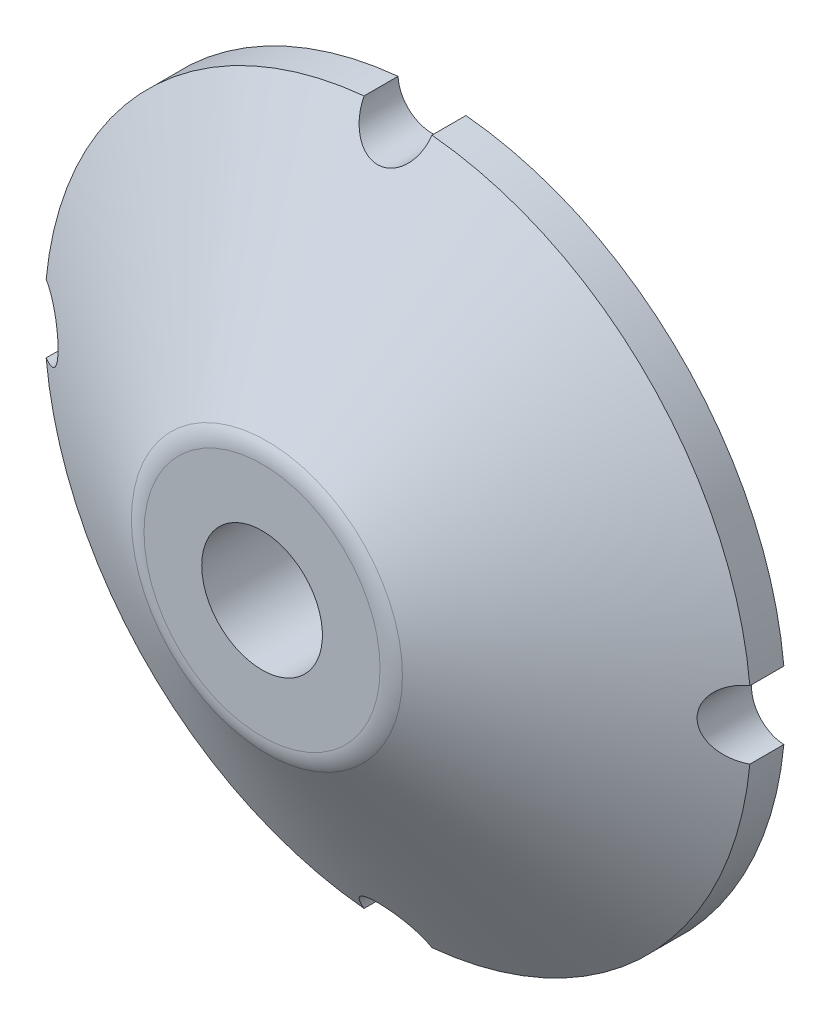
ISO-10303-21;
HEADER;
FILE_DESCRIPTION(('STEP AP214'),'2;1');
FILE_NAME('part.step','',(''),(''),'','','');
FILE_SCHEMA(('AUTOMOTIVE_DESIGN { 1 0 10303 214 1 1 1 1 }'));
ENDSEC;
DATA;
#1=APPLICATION_CONTEXT('core data for automotive mechanical design processes');
#2=APPLICATION_PROTOCOL_DEFINITION('international standard','automotive_design',2000,#1);
#3=PRODUCT_CONTEXT('',#1,'mechanical');
#4=PRODUCT('Part','Part','',(#3));
#5=PRODUCT_RELATED_PRODUCT_CATEGORY('part','',(#4));
#6=PRODUCT_DEFINITION_FORMATION('','',#4);
#7=PRODUCT_DEFINITION_CONTEXT('part definition',#1,'design');
#8=PRODUCT_DEFINITION('design','',#6,#7);
#9=PRODUCT_DEFINITION_SHAPE('','',#8);
#10=(LENGTH_UNIT() NAMED_UNIT(*) SI_UNIT(.MILLI.,.METRE.));
#11=(NAMED_UNIT(*) PLANE_ANGLE_UNIT() SI_UNIT($,.RADIAN.));
#12=(NAMED_UNIT(*) SI_UNIT($,.STERADIAN.) SOLID_ANGLE_UNIT());
#13=UNCERTAINTY_MEASURE_WITH_UNIT(LENGTH_MEASURE(1.E-05),#10,'distance_accuracy_value','');
#14=(GEOMETRIC_REPRESENTATION_CONTEXT(3) GLOBAL_UNCERTAINTY_ASSIGNED_CONTEXT((#13)) GLOBAL_UNIT_ASSIGNED_CONTEXT((#10,
#11,#12)) REPRESENTATION_CONTEXT('',''));
#15=CARTESIAN_POINT('',(0.,0.,0.));
#16=DIRECTION('',(0.,0.,1.));
#17=DIRECTION('',(1.,0.,0.));
#18=AXIS2_PLACEMENT_3D('',#15,#16,#17);
#19=CARTESIAN_POINT('',(0.,17.,0.));
#20=DIRECTION('',(0.,0.,-1.));
#21=DIRECTION('',(-1.,0.,0.));
#22=AXIS2_PLACEMENT_3D('',#19,#20,#21);
#23=PLANE('',#22);
#24=CARTESIAN_POINT('',(0.,0.,0.));
#25=DIRECTION('',(0.,0.,-1.));
#26=DIRECTION('',(-1.,0.,0.));
#27=AXIS2_PLACEMENT_3D('',#24,#25,#26);
#28=CIRCLE('',#27,17.);
#29=CARTESIAN_POINT('',(-17.,0.,0.));
#30=VERTEX_POINT('',#29);
#31=EDGE_CURVE('E127',#30,#30,#28,.T.);
#32=ORIENTED_EDGE('',*,*,#31,.F.);
#33=EDGE_LOOP('',(#32));
#34=FACE_BOUND('',#33,.T.);
#35=CARTESIAN_POINT('',(0.,0.,0.));
#36=DIRECTION('',(0.,0.,-1.));
#37=DIRECTION('',(-1.,0.,0.));
#38=AXIS2_PLACEMENT_3D('',#35,#36,#37);
#39=CIRCLE('',#38,20.8);
#40=CARTESIAN_POINT('',(-1.99768727229009,-20.7038461538462,0.));
#41=VERTEX_POINT('',#40);
#42=CARTESIAN_POINT('',(-20.7038461538462,-1.9976872722901,0.));
#43=VERTEX_POINT('',#42);
#44=EDGE_CURVE('E112',#41,#43,#39,.T.);
#45=ORIENTED_EDGE('',*,*,#44,.T.);
#46=CARTESIAN_POINT('',(-20.8,0.,0.));
#47=DIRECTION('',(0.,0.,1.));
#48=DIRECTION('',(1.,0.,0.));
#49=AXIS2_PLACEMENT_3D('',#46,#47,#48);
#50=CIRCLE('',#49,2.);
#51=CARTESIAN_POINT('',(-20.7038461538462,1.99768727229009,0.));
#52=VERTEX_POINT('',#51);
#53=EDGE_CURVE('E98',#43,#52,#50,.T.);
#54=ORIENTED_EDGE('',*,*,#53,.T.);
#55=CARTESIAN_POINT('',(-1.99768727229009,20.7038461538462,0.));
#56=VERTEX_POINT('',#55);
#57=EDGE_CURVE('E120',#52,#56,#39,.T.);
#58=ORIENTED_EDGE('',*,*,#57,.T.);
#59=CARTESIAN_POINT('',(0.,20.8,0.));
#60=DIRECTION('',(0.,0.,1.));
#61=DIRECTION('',(1.,0.,0.));
#62=AXIS2_PLACEMENT_3D('',#59,#60,#61);
#63=CIRCLE('',#62,2.);
#64=CARTESIAN_POINT('',(1.99768727229009,20.7038461538462,0.));
#65=VERTEX_POINT('',#64);
#66=EDGE_CURVE('E180',#56,#65,#63,.T.);
#67=ORIENTED_EDGE('',*,*,#66,.T.);
#68=CARTESIAN_POINT('',(20.7038461538462,1.99768727229009,0.));
#69=VERTEX_POINT('',#68);
#70=EDGE_CURVE('E122',#65,#69,#39,.T.);
#71=ORIENTED_EDGE('',*,*,#70,.T.);
#72=CARTESIAN_POINT('',(20.8,0.,0.));
#73=DIRECTION('',(0.,0.,1.));
#74=DIRECTION('',(1.,0.,0.));
#75=AXIS2_PLACEMENT_3D('',#72,#73,#74);
#76=CIRCLE('',#75,2.);
#77=CARTESIAN_POINT('',(20.7038461538462,-1.99768727229009,0.));
#78=VERTEX_POINT('',#77);
#79=EDGE_CURVE('E264',#69,#78,#76,.T.);
#80=ORIENTED_EDGE('',*,*,#79,.T.);
#81=CARTESIAN_POINT('',(1.99768727229009,-20.7038461538462,0.));
#82=VERTEX_POINT('',#81);
#83=EDGE_CURVE('E119',#78,#82,#39,.T.);
#84=ORIENTED_EDGE('',*,*,#83,.T.);
#85=CARTESIAN_POINT('',(0.,-20.8,0.));
#86=DIRECTION('',(0.,0.,1.));
#87=DIRECTION('',(1.,0.,0.));
#88=AXIS2_PLACEMENT_3D('',#85,#86,#87);
#89=CIRCLE('',#88,2.);
#90=EDGE_CURVE('E118',#82,#41,#89,.T.);
#91=ORIENTED_EDGE('',*,*,#90,.T.);
#92=EDGE_LOOP('',(#45,#54,#58,#67,#71,#80,#84,#91));
#93=FACE_BOUND('',#92,.T.);
#94=ADVANCED_FACE('F35',(#34,#93),#23,.T.);
#95=CARTESIAN_POINT('',(0.,0.,0.));
#96=DIRECTION('',(0.,0.,-1.));
#97=DIRECTION('',(-1.,0.,0.));
#98=AXIS2_PLACEMENT_3D('',#95,#96,#97);
#99=CYLINDRICAL_SURFACE('',#98,20.8);
#100=ORIENTED_EDGE('',*,*,#57,.F.);
#101=DIRECTION('',(0.,0.,-1.));
#102=VECTOR('',#101,1.);
#103=CARTESIAN_POINT('',(-20.7038461538462,1.99768727229009,1.));
#104=LINE('',#103,#102);
#105=CARTESIAN_POINT('',(-20.7038461538462,1.99768727229009,2.));
#106=VERTEX_POINT('',#105);
#107=EDGE_CURVE('E101',#106,#52,#104,.T.);
#108=ORIENTED_EDGE('',*,*,#107,.F.);
#109=CARTESIAN_POINT('',(0.,0.,2.));
#110=DIRECTION('',(0.,0.,-1.));
#111=DIRECTION('',(-1.,0.,0.));
#112=AXIS2_PLACEMENT_3D('',#109,#110,#111);
#113=CIRCLE('',#112,20.8);
#114=CARTESIAN_POINT('',(-1.99768727229009,20.7038461538462,2.));
#115=VERTEX_POINT('',#114);
#116=EDGE_CURVE('E198',#106,#115,#113,.T.);
#117=ORIENTED_EDGE('',*,*,#116,.T.);
#118=DIRECTION('',(0.,0.,-1.));
#119=VECTOR('',#118,1.);
#120=CARTESIAN_POINT('',(-1.99768727229009,20.7038461538462,1.));
#121=LINE('',#120,#119);
#122=EDGE_CURVE('E266',#56,#115,#121,.F.);
#123=ORIENTED_EDGE('',*,*,#122,.F.);
#124=EDGE_LOOP('',(#100,#108,#117,#123));
#125=FACE_BOUND('',#124,.T.);
#126=ADVANCED_FACE('F145',(#125),#99,.T.);
#127=CARTESIAN_POINT('',(-1.99768727229009,-20.7038461538462,2.));
#128=VERTEX_POINT('',#127);
#129=CARTESIAN_POINT('',(-20.7038461538462,-1.9976872722901,2.));
#130=VERTEX_POINT('',#129);
#131=EDGE_CURVE('E114',#128,#130,#113,.T.);
#132=ORIENTED_EDGE('',*,*,#131,.T.);
#133=DIRECTION('',(0.,0.,-1.));
#134=VECTOR('',#133,1.);
#135=CARTESIAN_POINT('',(-20.7038461538462,-1.9976872722901,1.));
#136=LINE('',#135,#134);
#137=EDGE_CURVE('E50',#43,#130,#136,.F.);
#138=ORIENTED_EDGE('',*,*,#137,.F.);
#139=ORIENTED_EDGE('',*,*,#44,.F.);
#140=DIRECTION('',(0.,0.,-1.));
#141=VECTOR('',#140,1.);
#142=CARTESIAN_POINT('',(-1.99768727229009,-20.7038461538462,1.));
#143=LINE('',#142,#141);
#144=EDGE_CURVE('E240',#128,#41,#143,.T.);
#145=ORIENTED_EDGE('',*,*,#144,.F.);
#146=EDGE_LOOP('',(#132,#138,#139,#145));
#147=FACE_BOUND('',#146,.T.);
#148=ADVANCED_FACE('F110',(#147),#99,.T.);
#149=CARTESIAN_POINT('',(0.,0.,2.));
#150=DIRECTION('',(0.,0.,-1.));
#151=DIRECTION('',(-1.,0.,0.));
#152=AXIS2_PLACEMENT_3D('',#149,#150,#151);
#153=CONICAL_SURFACE('',#152,20.8,1.02927185459833);
#154=CARTESIAN_POINT('',(0.,0.,9.7138477979579));
#155=DIRECTION('',(0.,0.,1.));
#156=DIRECTION('',(1.,0.,0.));
#157=AXIS2_PLACEMENT_3D('',#154,#155,#156);
#158=CIRCLE('',#157,7.97572803589499);
#159=CARTESIAN_POINT('',(7.97572803589499,0.,9.7138477979579));
#160=VERTEX_POINT('',#159);
#161=EDGE_CURVE('E43',#160,#160,#158,.F.);
#162=ORIENTED_EDGE('',*,*,#161,.T.);
#163=EDGE_LOOP('',(#162));
#164=FACE_BOUND('',#163,.T.);
#165=ORIENTED_EDGE('',*,*,#116,.F.);
#166=CARTESIAN_POINT('',(-20.7041786565039,-1.9977032487661,1.99979999999989));
#167=CARTESIAN_POINT('',(-20.5586416011213,-1.99073290417969,2.08728640097025));
#168=CARTESIAN_POINT('',(-20.4139077991781,-1.967831763049,2.1753121498344));
#169=CARTESIAN_POINT('',(-20.1304472498115,-1.89035627195168,2.34949197709587));
#170=CARTESIAN_POINT('',(-19.991773500038,-1.83554641435802,2.4356271432097));
#171=CARTESIAN_POINT('',(-19.7426338778025,-1.70279617114001,2.59195823833128));
#172=CARTESIAN_POINT('',(-19.630765372245,-1.62830710045065,2.66284056761539));
#173=CARTESIAN_POINT('',(-19.4218167294599,-1.45562914499135,2.79631115772232));
#174=CARTESIAN_POINT('',(-19.3246779588634,-1.35753847407497,2.85893216684074));
#175=CARTESIAN_POINT('',(-19.1747955868022,-1.16996285626182,2.9562025446678));
#176=CARTESIAN_POINT('',(-19.1172466085535,-1.08580271656086,2.99376768712256));
#177=CARTESIAN_POINT('',(-19.0146399184898,-0.907232393332686,3.06100772525477));
#178=CARTESIAN_POINT('',(-18.9695791302043,-0.812824742273569,3.09068456414511));
#179=CARTESIAN_POINT('',(-18.8940272649039,-0.615237993411322,3.14057726312456));
#180=CARTESIAN_POINT('',(-18.8636269134673,-0.51200881520496,3.16073419416272));
#181=CARTESIAN_POINT('',(-18.8197623995859,-0.300493961621938,3.18985371484071));
#182=CARTESIAN_POINT('',(-18.8062864090251,-0.192211872582624,3.19882412249932));
#183=CARTESIAN_POINT('',(-18.7976905677202,0.0135014108294007,3.20454439333401));
#184=CARTESIAN_POINT('',(-18.8007275645012,0.110826830551584,3.20252134389357));
#185=CARTESIAN_POINT('',(-18.8207739450462,0.303358831769824,3.18918910211895));
#186=CARTESIAN_POINT('',(-18.8377813842353,0.398565706256424,3.17788120216249));
#187=CARTESIAN_POINT('',(-18.8842180616984,0.581800156899532,3.1470891942953));
#188=CARTESIAN_POINT('',(-18.9133175260579,0.669949237303081,3.12782222291343));
#189=CARTESIAN_POINT('',(-18.9825437043882,0.839804378239371,3.08214875450569));
#190=CARTESIAN_POINT('',(-19.0226732954475,0.921508750574153,3.05574039475538));
#191=CARTESIAN_POINT('',(-19.1163927843596,1.08398347529431,2.99433049018485));
#192=CARTESIAN_POINT('',(-19.1708566849813,1.16403829421563,2.9587770914947));
#193=CARTESIAN_POINT('',(-19.2890830957558,1.31386844915183,2.88201646227923));
#194=CARTESIAN_POINT('',(-19.3528493144695,1.38363966298844,2.84080697722783));
#195=CARTESIAN_POINT('',(-19.4981216932371,1.52205085967941,2.74747712021278));
#196=CARTESIAN_POINT('',(-19.5808524884666,1.5889268067049,2.69464898575496));
#197=CARTESIAN_POINT('',(-19.7539624967148,1.70788026677894,2.5849104449291));
#198=CARTESIAN_POINT('',(-19.8443498430974,1.75994178038517,2.52799570749178));
#199=CARTESIAN_POINT('',(-20.0452277154851,1.85595578155099,2.40245350682534));
#200=CARTESIAN_POINT('',(-20.1566538820859,1.8973739214745,2.33338452426101));
#201=CARTESIAN_POINT('',(-20.3839414847301,1.95978330839613,2.19372951978411));
#202=CARTESIAN_POINT('',(-20.499795232066,1.98080843060422,2.12314621343046));
#203=CARTESIAN_POINT('',(-20.6456736579764,1.99425284234459,2.03502725228237));
#204=CARTESIAN_POINT('',(-20.6749113619588,1.99630017353421,2.01740358888363));
#205=CARTESIAN_POINT('',(-20.7041786565039,1.99770324876609,1.99979999999989));
#206=B_SPLINE_CURVE_WITH_KNOTS('',3,(#166,#167,#168,#169,#170,#171,#172,#173,#174,#175,#176,
#177,#178,#179,#180,#181,#182,#183,#184,#185,#186,#187,#188,#189,#190,#191,#192,#193,#194,#195,
#196,#197,#198,#199,#200,#201,#202,#203,#204,#205),.UNSPECIFIED.,.F.,.F.,(4,2,2,2,2,2,2,2,2,2,2,
2,2,2,2,2,2,2,2,4),(0.,0.509554990811148,1.0229193931966,1.47629511988268,1.92781587676408,
2.25248183821207,2.57706774683279,2.90363735682386,3.22997860625034,3.5206969766378,
3.81137488818691,4.09459767240063,4.37789440241981,4.68613273111527,4.9944942829167,
5.3494512859905,5.70479019666885,6.11559656084411,6.52571935248949,6.6282918216377),.UNSPECIFIED.);
#207=EDGE_CURVE('E105',#130,#106,#206,.T.);
#208=ORIENTED_EDGE('',*,*,#207,.F.);
#209=ORIENTED_EDGE('',*,*,#131,.F.);
#210=CARTESIAN_POINT('',(1.9977032487661,-20.7041786565039,1.99979999999989));
#211=CARTESIAN_POINT('',(1.99073290417969,-20.5586416011213,2.08728640097025));
#212=CARTESIAN_POINT('',(1.96783176304899,-20.4139077991781,2.1753121498344));
#213=CARTESIAN_POINT('',(1.89035627195168,-20.1304472498115,2.34949197709587));
#214=CARTESIAN_POINT('',(1.83554641435801,-19.991773500038,2.43562714320971));
#215=CARTESIAN_POINT('',(1.70279617114,-19.7426338778025,2.59195823833128));
#216=CARTESIAN_POINT('',(1.62830710045065,-19.630765372245,2.66284056761539));
#217=CARTESIAN_POINT('',(1.45562914499134,-19.4218167294599,2.79631115772232));
#218=CARTESIAN_POINT('',(1.35753847407497,-19.3246779588634,2.85893216684074));
#219=CARTESIAN_POINT('',(1.16996285626181,-19.1747955868022,2.9562025446678));
#220=CARTESIAN_POINT('',(1.08580271656086,-19.1172466085535,2.99376768712256));
#221=CARTESIAN_POINT('',(0.907232393332684,-19.0146399184898,3.06100772525477));
#222=CARTESIAN_POINT('',(0.812824742273568,-18.9695791302043,3.0906845641451));
#223=CARTESIAN_POINT('',(0.615237993411322,-18.8940272649039,3.14057726312456));
#224=CARTESIAN_POINT('',(0.512008815204959,-18.8636269134673,3.16073419416272));
#225=CARTESIAN_POINT('',(0.300493961621936,-18.8197623995859,3.18985371484071));
#226=CARTESIAN_POINT('',(0.192211872582623,-18.8062864090251,3.19882412249932));
#227=CARTESIAN_POINT('',(-0.013501410829402,-18.7976905677203,3.20454439333401));
#228=CARTESIAN_POINT('',(-0.110826830551586,-18.8007275645012,3.20252134389357));
#229=CARTESIAN_POINT('',(-0.303358831769826,-18.8207739450462,3.18918910211895));
#230=CARTESIAN_POINT('',(-0.398565706256426,-18.8377813842353,3.17788120216249));
#231=CARTESIAN_POINT('',(-0.581800156899533,-18.8842180616984,3.1470891942953));
#232=CARTESIAN_POINT('',(-0.669949237303082,-18.9133175260579,3.12782222291343));
#233=CARTESIAN_POINT('',(-0.839804378239371,-18.9825437043882,3.08214875450569));
#234=CARTESIAN_POINT('',(-0.921508750574154,-19.0226732954475,3.05574039475537));
#235=CARTESIAN_POINT('',(-1.08398347529431,-19.1163927843596,2.99433049018484));
#236=CARTESIAN_POINT('',(-1.16403829421563,-19.1708566849814,2.9587770914947));
#237=CARTESIAN_POINT('',(-1.31386844915184,-19.2890830957558,2.88201646227922));
#238=CARTESIAN_POINT('',(-1.38363966298844,-19.3528493144695,2.84080697722783));
#239=CARTESIAN_POINT('',(-1.52205085967941,-19.4981216932371,2.74747712021278));
#240=CARTESIAN_POINT('',(-1.5889268067049,-19.5808524884666,2.69464898575496));
#241=CARTESIAN_POINT('',(-1.70788026677894,-19.7539624967148,2.58491044492909));
#242=CARTESIAN_POINT('',(-1.75994178038517,-19.8443498430974,2.52799570749178));
#243=CARTESIAN_POINT('',(-1.85595578155099,-20.0452277154851,2.40245350682534));
#244=CARTESIAN_POINT('',(-1.8973739214745,-20.1566538820859,2.33338452426102));
#245=CARTESIAN_POINT('',(-1.95978330839613,-20.3839414847301,2.19372951978411));
#246=CARTESIAN_POINT('',(-1.98080843060422,-20.499795232066,2.12314621343046));
#247=CARTESIAN_POINT('',(-1.99425284234459,-20.6456736579764,2.03502725228237));
#248=CARTESIAN_POINT('',(-1.99630017353421,-20.6749113619588,2.01740358888363));
#249=CARTESIAN_POINT('',(-1.99770324876609,-20.7041786565039,1.99979999999989));
#250=B_SPLINE_CURVE_WITH_KNOTS('',3,(#210,#211,#212,#213,#214,#215,#216,#217,#218,#219,#220,
#221,#222,#223,#224,#225,#226,#227,#228,#229,#230,#231,#232,#233,#234,#235,#236,#237,#238,#239,
#240,#241,#242,#243,#244,#245,#246,#247,#248,#249),.UNSPECIFIED.,.F.,.F.,(4,2,2,2,2,2,2,2,2,2,2,
2,2,2,2,2,2,2,2,4),(0.,0.509554990811145,1.0229193931966,1.47629511988268,1.92781587676408,
2.25248183821207,2.57706774683278,2.90363735682386,3.22997860625034,3.5206969766378,
3.81137488818691,4.09459767240062,4.37789440241981,4.68613273111527,4.9944942829167,
5.34945128599049,5.70479019666884,6.1155965608441,6.52571935248948,6.62829182163769),.UNSPECIFIED.);
#251=CARTESIAN_POINT('',(1.99768727229009,-20.7038461538462,2.));
#252=VERTEX_POINT('',#251);
#253=EDGE_CURVE('E217',#252,#128,#250,.T.);
#254=ORIENTED_EDGE('',*,*,#253,.F.);
#255=CARTESIAN_POINT('',(20.7038461538462,-1.99768727229009,2.));
#256=VERTEX_POINT('',#255);
#257=EDGE_CURVE('E204',#256,#252,#113,.T.);
#258=ORIENTED_EDGE('',*,*,#257,.F.);
#259=CARTESIAN_POINT('',(20.7041786565039,1.9977032487661,1.99979999999989));
#260=CARTESIAN_POINT('',(20.5586416011213,1.99073290417969,2.08728640097025));
#261=CARTESIAN_POINT('',(20.4139077991781,1.96783176304899,2.1753121498344));
#262=CARTESIAN_POINT('',(20.1304472498115,1.89035627195168,2.34949197709587));
#263=CARTESIAN_POINT('',(19.991773500038,1.83554641435801,2.43562714320971));
#264=CARTESIAN_POINT('',(19.7426338778025,1.70279617114001,2.59195823833128));
#265=CARTESIAN_POINT('',(19.630765372245,1.62830710045065,2.66284056761539));
#266=CARTESIAN_POINT('',(19.4218167294599,1.45562914499134,2.79631115772232));
#267=CARTESIAN_POINT('',(19.3246779588634,1.35753847407497,2.85893216684074));
#268=CARTESIAN_POINT('',(19.1747955868022,1.16996285626182,2.9562025446678));
#269=CARTESIAN_POINT('',(19.1172466085535,1.08580271656086,2.99376768712256));
#270=CARTESIAN_POINT('',(19.0146399184898,0.907232393332686,3.06100772525477));
#271=CARTESIAN_POINT('',(18.9695791302043,0.81282474227357,3.0906845641451));
#272=CARTESIAN_POINT('',(18.8940272649039,0.615237993411324,3.14057726312456));
#273=CARTESIAN_POINT('',(18.8636269134673,0.512008815204961,3.16073419416272));
#274=CARTESIAN_POINT('',(18.8197623995859,0.300493961621939,3.18985371484071));
#275=CARTESIAN_POINT('',(18.8062864090251,0.192211872582625,3.19882412249932));
#276=CARTESIAN_POINT('',(18.7976905677202,-0.0135014108293994,3.20454439333401));
#277=CARTESIAN_POINT('',(18.8007275645012,-0.110826830551583,3.20252134389357));
#278=CARTESIAN_POINT('',(18.8207739450462,-0.303358831769823,3.18918910211895));
#279=CARTESIAN_POINT('',(18.8377813842353,-0.398565706256423,3.17788120216249));
#280=CARTESIAN_POINT('',(18.8842180616984,-0.581800156899532,3.1470891942953));
#281=CARTESIAN_POINT('',(18.9133175260579,-0.669949237303081,3.12782222291344));
#282=CARTESIAN_POINT('',(18.9825437043882,-0.83980437823937,3.08214875450569));
#283=CARTESIAN_POINT('',(19.0226732954475,-0.921508750574153,3.05574039475538));
#284=CARTESIAN_POINT('',(19.1163927843596,-1.08398347529431,2.99433049018485));
#285=CARTESIAN_POINT('',(19.1708566849813,-1.16403829421563,2.9587770914947));
#286=CARTESIAN_POINT('',(19.2890830957558,-1.31386844915184,2.88201646227923));
#287=CARTESIAN_POINT('',(19.3528493144695,-1.38363966298844,2.84080697722783));
#288=CARTESIAN_POINT('',(19.4981216932371,-1.52205085967941,2.74747712021278));
#289=CARTESIAN_POINT('',(19.5808524884666,-1.5889268067049,2.69464898575496));
#290=CARTESIAN_POINT('',(19.7539624967148,-1.70788026677894,2.5849104449291));
#291=CARTESIAN_POINT('',(19.8443498430974,-1.75994178038517,2.52799570749178));
#292=CARTESIAN_POINT('',(20.0452277154851,-1.85595578155099,2.40245350682534));
#293=CARTESIAN_POINT('',(20.1566538820858,-1.8973739214745,2.33338452426102));
#294=CARTESIAN_POINT('',(20.3839414847301,-1.95978330839613,2.19372951978412));
#295=CARTESIAN_POINT('',(20.499795232066,-1.98080843060422,2.12314621343046));
#296=CARTESIAN_POINT('',(20.6456736579764,-1.9942528423446,2.03502725228237));
#297=CARTESIAN_POINT('',(20.6749113619588,-1.99630017353421,2.01740358888363));
#298=CARTESIAN_POINT('',(20.7041786565039,-1.9977032487661,1.99979999999989));
#299=B_SPLINE_CURVE_WITH_KNOTS('',3,(#259,#260,#261,#262,#263,#264,#265,#266,#267,#268,#269,
#270,#271,#272,#273,#274,#275,#276,#277,#278,#279,#280,#281,#282,#283,#284,#285,#286,#287,#288,
#289,#290,#291,#292,#293,#294,#295,#296,#297,#298),.UNSPECIFIED.,.F.,.F.,(4,2,2,2,2,2,2,2,2,2,2,
2,2,2,2,2,2,2,2,4),(0.,0.509554990811145,1.0229193931966,1.47629511988268,1.92781587676408,
2.25248183821207,2.57706774683278,2.90363735682386,3.22997860625034,3.5206969766378,
3.81137488818691,4.09459767240062,4.37789440241981,4.68613273111527,4.9944942829167,
5.34945128599049,5.70479019666885,6.1155965608441,6.52571935248948,6.6282918216377),.UNSPECIFIED.);
#300=CARTESIAN_POINT('',(20.7038461538462,1.99768727229009,2.));
#301=VERTEX_POINT('',#300);
#302=EDGE_CURVE('E216',#301,#256,#299,.T.);
#303=ORIENTED_EDGE('',*,*,#302,.F.);
#304=CARTESIAN_POINT('',(1.99768727229009,20.7038461538462,2.));
#305=VERTEX_POINT('',#304);
#306=EDGE_CURVE('E123',#305,#301,#113,.T.);
#307=ORIENTED_EDGE('',*,*,#306,.F.);
#308=CARTESIAN_POINT('',(-1.9977032487661,20.7041786565039,1.99979999999989));
#309=CARTESIAN_POINT('',(-1.99073290417969,20.5586416011213,2.08728640097025));
#310=CARTESIAN_POINT('',(-1.96783176304899,20.4139077991781,2.1753121498344));
#311=CARTESIAN_POINT('',(-1.89035627195168,20.1304472498115,2.34949197709587));
#312=CARTESIAN_POINT('',(-1.83554641435801,19.991773500038,2.43562714320971));
#313=CARTESIAN_POINT('',(-1.70279617114,19.7426338778025,2.59195823833128));
#314=CARTESIAN_POINT('',(-1.62830710045065,19.630765372245,2.66284056761539));
#315=CARTESIAN_POINT('',(-1.45562914499134,19.4218167294599,2.79631115772232));
#316=CARTESIAN_POINT('',(-1.35753847407497,19.3246779588634,2.85893216684074));
#317=CARTESIAN_POINT('',(-1.16996285626181,19.1747955868022,2.9562025446678));
#318=CARTESIAN_POINT('',(-1.08580271656086,19.1172466085535,2.99376768712256));
#319=CARTESIAN_POINT('',(-0.907232393332682,19.0146399184898,3.06100772525477));
#320=CARTESIAN_POINT('',(-0.812824742273565,18.9695791302043,3.0906845641451));
#321=CARTESIAN_POINT('',(-0.615237993411319,18.8940272649039,3.14057726312456));
#322=CARTESIAN_POINT('',(-0.512008815204956,18.8636269134673,3.16073419416272));
#323=CARTESIAN_POINT('',(-0.300493961621933,18.8197623995859,3.18985371484071));
#324=CARTESIAN_POINT('',(-0.192211872582619,18.8062864090251,3.19882412249932));
#325=CARTESIAN_POINT('',(0.0135014108294054,18.7976905677203,3.20454439333401));
#326=CARTESIAN_POINT('',(0.110826830551589,18.8007275645012,3.20252134389357));
#327=CARTESIAN_POINT('',(0.303358831769829,18.8207739450462,3.18918910211895));
#328=CARTESIAN_POINT('',(0.398565706256429,18.8377813842353,3.17788120216249));
#329=CARTESIAN_POINT('',(0.581800156899537,18.8842180616984,3.1470891942953));
#330=CARTESIAN_POINT('',(0.669949237303085,18.9133175260579,3.12782222291343));
#331=CARTESIAN_POINT('',(0.839804378239374,18.9825437043882,3.08214875450569));
#332=CARTESIAN_POINT('',(0.921508750574157,19.0226732954475,3.05574039475537));
#333=CARTESIAN_POINT('',(1.08398347529431,19.1163927843596,2.99433049018484));
#334=CARTESIAN_POINT('',(1.16403829421563,19.1708566849814,2.9587770914947));
#335=CARTESIAN_POINT('',(1.31386844915184,19.2890830957558,2.88201646227922));
#336=CARTESIAN_POINT('',(1.38363966298845,19.3528493144695,2.84080697722782));
#337=CARTESIAN_POINT('',(1.52205085967941,19.4981216932371,2.74747712021278));
#338=CARTESIAN_POINT('',(1.58892680670491,19.5808524884666,2.69464898575496));
#339=CARTESIAN_POINT('',(1.70788026677894,19.7539624967148,2.58491044492909));
#340=CARTESIAN_POINT('',(1.75994178038517,19.8443498430974,2.52799570749178));
#341=CARTESIAN_POINT('',(1.85595578155099,20.0452277154851,2.40245350682533));
#342=CARTESIAN_POINT('',(1.8973739214745,20.1566538820859,2.33338452426101));
#343=CARTESIAN_POINT('',(1.95978330839613,20.3839414847301,2.19372951978411));
#344=CARTESIAN_POINT('',(1.98080843060422,20.499795232066,2.12314621343046));
#345=CARTESIAN_POINT('',(1.99425284234459,20.6456736579764,2.03502725228236));
#346=CARTESIAN_POINT('',(1.99630017353421,20.6749113619588,2.01740358888363));
#347=CARTESIAN_POINT('',(1.9977032487661,20.7041786565039,1.99979999999989));
#348=B_SPLINE_CURVE_WITH_KNOTS('',3,(#308,#309,#310,#311,#312,#313,#314,#315,#316,#317,#318,
#319,#320,#321,#322,#323,#324,#325,#326,#327,#328,#329,#330,#331,#332,#333,#334,#335,#336,#337,
#338,#339,#340,#341,#342,#343,#344,#345,#346,#347),.UNSPECIFIED.,.F.,.F.,(4,2,2,2,2,2,2,2,2,2,2,
2,2,2,2,2,2,2,2,4),(0.,0.509554990811145,1.0229193931966,1.47629511988268,1.92781587676408,
2.25248183821207,2.57706774683278,2.90363735682386,3.22997860625034,3.5206969766378,
3.81137488818691,4.09459767240062,4.37789440241981,4.68613273111527,4.9944942829167,
5.34945128599049,5.70479019666885,6.1155965608441,6.52571935248949,6.62829182163769),.UNSPECIFIED.);
#349=EDGE_CURVE('E175',#115,#305,#348,.T.);
#350=ORIENTED_EDGE('',*,*,#349,.F.);
#351=EDGE_LOOP('',(#165,#208,#209,#254,#258,#303,#307,#350));
#352=FACE_BOUND('',#351,.T.);
#353=ADVANCED_FACE('F133',(#164,#352),#153,.T.);
#354=ORIENTED_EDGE('',*,*,#257,.T.);
#355=DIRECTION('',(0.,0.,-1.));
#356=VECTOR('',#355,1.);
#357=CARTESIAN_POINT('',(1.99768727229009,-20.7038461538462,1.));
#358=LINE('',#357,#356);
#359=EDGE_CURVE('E58',#82,#252,#358,.F.);
#360=ORIENTED_EDGE('',*,*,#359,.F.);
#361=ORIENTED_EDGE('',*,*,#83,.F.);
#362=DIRECTION('',(0.,0.,-1.));
#363=VECTOR('',#362,1.);
#364=CARTESIAN_POINT('',(20.7038461538462,-1.99768727229009,1.));
#365=LINE('',#364,#363);
#366=EDGE_CURVE('E214',#256,#78,#365,.T.);
#367=ORIENTED_EDGE('',*,*,#366,.F.);
#368=EDGE_LOOP('',(#354,#360,#361,#367));
#369=FACE_BOUND('',#368,.T.);
#370=ADVANCED_FACE('F167',(#369),#99,.T.);
#371=ORIENTED_EDGE('',*,*,#306,.T.);
#372=DIRECTION('',(0.,0.,-1.));
#373=VECTOR('',#372,1.);
#374=CARTESIAN_POINT('',(20.7038461538462,1.99768727229009,1.));
#375=LINE('',#374,#373);
#376=EDGE_CURVE('E219',#69,#301,#375,.F.);
#377=ORIENTED_EDGE('',*,*,#376,.F.);
#378=ORIENTED_EDGE('',*,*,#70,.F.);
#379=DIRECTION('',(0.,0.,-1.));
#380=VECTOR('',#379,1.);
#381=CARTESIAN_POINT('',(1.99768727229009,20.7038461538462,1.));
#382=LINE('',#381,#380);
#383=EDGE_CURVE('E263',#305,#65,#382,.T.);
#384=ORIENTED_EDGE('',*,*,#383,.F.);
#385=EDGE_LOOP('',(#371,#377,#378,#384));
#386=FACE_BOUND('',#385,.T.);
#387=ADVANCED_FACE('F153',(#386),#99,.T.);
#388=CARTESIAN_POINT('',(0.,0.,0.));
#389=DIRECTION('',(0.,0.,-1.));
#390=DIRECTION('',(-1.,0.,0.));
#391=AXIS2_PLACEMENT_3D('',#388,#389,#390);
#392=CYLINDRICAL_SURFACE('',#391,17.);
#393=ORIENTED_EDGE('',*,*,#31,.T.);
#394=EDGE_LOOP('',(#393));
#395=FACE_BOUND('',#394,.T.);
#396=CARTESIAN_POINT('',(0.,0.,2.));
#397=DIRECTION('',(0.,0.,-1.));
#398=DIRECTION('',(-1.,0.,0.));
#399=AXIS2_PLACEMENT_3D('',#396,#397,#398);
#400=CIRCLE('',#399,17.);
#401=CARTESIAN_POINT('',(-17.,0.,2.));
#402=VERTEX_POINT('',#401);
#403=EDGE_CURVE('E172',#402,#402,#400,.T.);
#404=ORIENTED_EDGE('',*,*,#403,.F.);
#405=EDGE_LOOP('',(#404));
#406=FACE_BOUND('',#405,.T.);
#407=ADVANCED_FACE('F156',(#395,#406),#392,.F.);
#408=CARTESIAN_POINT('',(0.,3.55,10.));
#409=DIRECTION('',(0.,0.,1.));
#410=DIRECTION('',(1.,0.,0.));
#411=AXIS2_PLACEMENT_3D('',#408,#409,#410);
#412=PLANE('',#411);
#413=CARTESIAN_POINT('',(0.,0.,10.));
#414=DIRECTION('',(0.,0.,1.));
#415=DIRECTION('',(1.,0.,0.));
#416=AXIS2_PLACEMENT_3D('',#413,#414,#415);
#417=CIRCLE('',#416,6.94484214238647);
#418=CARTESIAN_POINT('',(6.94484214238647,0.,10.));
#419=VERTEX_POINT('',#418);
#420=EDGE_CURVE('E11',#419,#419,#417,.T.);
#421=ORIENTED_EDGE('',*,*,#420,.T.);
#422=EDGE_LOOP('',(#421));
#423=FACE_BOUND('',#422,.T.);
#424=CARTESIAN_POINT('',(0.,0.,10.));
#425=DIRECTION('',(0.,0.,-1.));
#426=DIRECTION('',(-1.,0.,0.));
#427=AXIS2_PLACEMENT_3D('',#424,#425,#426);
#428=CIRCLE('',#427,3.55);
#429=CARTESIAN_POINT('',(-3.55,0.,10.));
#430=VERTEX_POINT('',#429);
#431=EDGE_CURVE('E196',#430,#430,#428,.T.);
#432=ORIENTED_EDGE('',*,*,#431,.T.);
#433=EDGE_LOOP('',(#432));
#434=FACE_BOUND('',#433,.T.);
#435=ADVANCED_FACE('F158',(#423,#434),#412,.T.);
#436=CARTESIAN_POINT('',(0.,0.,0.));
#437=DIRECTION('',(0.,0.,-1.));
#438=DIRECTION('',(-1.,0.,0.));
#439=AXIS2_PLACEMENT_3D('',#436,#437,#438);
#440=CYLINDRICAL_SURFACE('',#439,3.55);
#441=CARTESIAN_POINT('',(0.,0.,0.));
#442=DIRECTION('',(0.,0.,-1.));
#443=DIRECTION('',(-1.,0.,0.));
#444=AXIS2_PLACEMENT_3D('',#441,#442,#443);
#445=CIRCLE('',#444,3.55);
#446=CARTESIAN_POINT('',(-3.55,0.,0.));
#447=VERTEX_POINT('',#446);
#448=EDGE_CURVE('E194',#447,#447,#445,.T.);
#449=ORIENTED_EDGE('',*,*,#448,.T.);
#450=EDGE_LOOP('',(#449));
#451=FACE_BOUND('',#450,.T.);
#452=ORIENTED_EDGE('',*,*,#431,.F.);
#453=EDGE_LOOP('',(#452));
#454=FACE_BOUND('',#453,.T.);
#455=ADVANCED_FACE('F164',(#451,#454),#440,.F.);
#456=CARTESIAN_POINT('',(0.,5.3,0.));
#457=DIRECTION('',(0.,0.,-1.));
#458=DIRECTION('',(-1.,0.,0.));
#459=AXIS2_PLACEMENT_3D('',#456,#457,#458);
#460=PLANE('',#459);
#461=CARTESIAN_POINT('',(0.,0.,0.));
#462=DIRECTION('',(0.,0.,-1.));
#463=DIRECTION('',(-1.,0.,0.));
#464=AXIS2_PLACEMENT_3D('',#461,#462,#463);
#465=CIRCLE('',#464,5.3);
#466=CARTESIAN_POINT('',(-5.3,0.,0.));
#467=VERTEX_POINT('',#466);
#468=EDGE_CURVE('E191',#467,#467,#465,.T.);
#469=ORIENTED_EDGE('',*,*,#468,.T.);
#470=EDGE_LOOP('',(#469));
#471=FACE_BOUND('',#470,.T.);
#472=ORIENTED_EDGE('',*,*,#448,.F.);
#473=EDGE_LOOP('',(#472));
#474=FACE_BOUND('',#473,.T.);
#475=ADVANCED_FACE('F284',(#471,#474),#460,.T.);
#476=CARTESIAN_POINT('',(0.,0.,0.));
#477=DIRECTION('',(0.,0.,-1.));
#478=DIRECTION('',(-1.,0.,0.));
#479=AXIS2_PLACEMENT_3D('',#476,#477,#478);
#480=CYLINDRICAL_SURFACE('',#479,5.3);
#481=CARTESIAN_POINT('',(0.,0.,7.6));
#482=DIRECTION('',(0.,0.,-1.));
#483=DIRECTION('',(-1.,0.,0.));
#484=AXIS2_PLACEMENT_3D('',#481,#482,#483);
#485=CIRCLE('',#484,5.3);
#486=CARTESIAN_POINT('',(-5.3,0.,7.6));
#487=VERTEX_POINT('',#486);
#488=EDGE_CURVE('E178',#487,#487,#485,.T.);
#489=ORIENTED_EDGE('',*,*,#488,.T.);
#490=EDGE_LOOP('',(#489));
#491=FACE_BOUND('',#490,.T.);
#492=ORIENTED_EDGE('',*,*,#468,.F.);
#493=EDGE_LOOP('',(#492));
#494=FACE_BOUND('',#493,.T.);
#495=ADVANCED_FACE('F280',(#491,#494),#480,.T.);
#496=CARTESIAN_POINT('',(0.,7.5,7.6));
#497=DIRECTION('',(0.,0.,-1.));
#498=DIRECTION('',(-1.,0.,0.));
#499=AXIS2_PLACEMENT_3D('',#496,#497,#498);
#500=PLANE('',#499);
#501=CARTESIAN_POINT('',(0.,0.,7.6));
#502=DIRECTION('',(0.,0.,-1.));
#503=DIRECTION('',(-1.,0.,0.));
#504=AXIS2_PLACEMENT_3D('',#501,#502,#503);
#505=CIRCLE('',#504,7.5);
#506=CARTESIAN_POINT('',(-7.5,0.,7.6));
#507=VERTEX_POINT('',#506);
#508=EDGE_CURVE('E174',#507,#507,#505,.T.);
#509=ORIENTED_EDGE('',*,*,#508,.T.);
#510=EDGE_LOOP('',(#509));
#511=FACE_BOUND('',#510,.T.);
#512=ORIENTED_EDGE('',*,*,#488,.F.);
#513=EDGE_LOOP('',(#512));
#514=FACE_BOUND('',#513,.T.);
#515=ADVANCED_FACE('F277',(#511,#514),#500,.T.);
#516=CARTESIAN_POINT('',(0.,0.,7.6));
#517=DIRECTION('',(0.,0.,-1.));
#518=DIRECTION('',(-1.,0.,0.));
#519=AXIS2_PLACEMENT_3D('',#516,#517,#518);
#520=CONICAL_SURFACE('',#519,7.5,1.03815271956538);
#521=ORIENTED_EDGE('',*,*,#403,.T.);
#522=EDGE_LOOP('',(#521));
#523=FACE_BOUND('',#522,.T.);
#524=ORIENTED_EDGE('',*,*,#508,.F.);
#525=EDGE_LOOP('',(#524));
#526=FACE_BOUND('',#525,.T.);
#527=ADVANCED_FACE('F252',(#523,#526),#520,.F.);
#528=CARTESIAN_POINT('',(0.,20.8,10.001));
#529=DIRECTION('',(0.,0.,-1.));
#530=DIRECTION('',(-1.,0.,0.));
#531=AXIS2_PLACEMENT_3D('',#528,#529,#530);
#532=CYLINDRICAL_SURFACE('',#531,2.);
#533=ORIENTED_EDGE('',*,*,#122,.T.);
#534=ORIENTED_EDGE('',*,*,#349,.T.);
#535=ORIENTED_EDGE('',*,*,#383,.T.);
#536=ORIENTED_EDGE('',*,*,#66,.F.);
#537=EDGE_LOOP('',(#533,#534,#535,#536));
#538=FACE_BOUND('',#537,.T.);
#539=ADVANCED_FACE('F246',(#538),#532,.F.);
#540=CARTESIAN_POINT('',(20.8,0.,10.001));
#541=DIRECTION('',(0.,0.,-1.));
#542=DIRECTION('',(-1.,0.,0.));
#543=AXIS2_PLACEMENT_3D('',#540,#541,#542);
#544=CYLINDRICAL_SURFACE('',#543,2.);
#545=ORIENTED_EDGE('',*,*,#376,.T.);
#546=ORIENTED_EDGE('',*,*,#302,.T.);
#547=ORIENTED_EDGE('',*,*,#366,.T.);
#548=ORIENTED_EDGE('',*,*,#79,.F.);
#549=EDGE_LOOP('',(#545,#546,#547,#548));
#550=FACE_BOUND('',#549,.T.);
#551=ADVANCED_FACE('F242',(#550),#544,.F.);
#552=CARTESIAN_POINT('',(0.,-20.8,10.001));
#553=DIRECTION('',(0.,0.,-1.));
#554=DIRECTION('',(-1.,0.,0.));
#555=AXIS2_PLACEMENT_3D('',#552,#553,#554);
#556=CYLINDRICAL_SURFACE('',#555,2.);
#557=ORIENTED_EDGE('',*,*,#359,.T.);
#558=ORIENTED_EDGE('',*,*,#253,.T.);
#559=ORIENTED_EDGE('',*,*,#144,.T.);
#560=ORIENTED_EDGE('',*,*,#90,.F.);
#561=EDGE_LOOP('',(#557,#558,#559,#560));
#562=FACE_BOUND('',#561,.T.);
#563=ADVANCED_FACE('F141',(#562),#556,.F.);
#564=CARTESIAN_POINT('',(-20.8,0.,10.001));
#565=DIRECTION('',(0.,0.,-1.));
#566=DIRECTION('',(-1.,0.,0.));
#567=AXIS2_PLACEMENT_3D('',#564,#565,#566);
#568=CYLINDRICAL_SURFACE('',#567,2.);
#569=ORIENTED_EDGE('',*,*,#137,.T.);
#570=ORIENTED_EDGE('',*,*,#207,.T.);
#571=ORIENTED_EDGE('',*,*,#107,.T.);
#572=ORIENTED_EDGE('',*,*,#53,.F.);
#573=EDGE_LOOP('',(#569,#570,#571,#572));
#574=FACE_BOUND('',#573,.T.);
#575=ADVANCED_FACE('F99',(#574),#568,.F.);
#576=CARTESIAN_POINT('',(0.,0.,8.));
#577=DIRECTION('',(0.,0.,1.));
#578=DIRECTION('',(1.,0.,0.));
#579=AXIS2_PLACEMENT_3D('',#576,#577,#578);
#580=TOROIDAL_SURFACE('',#579,6.94484214238647,2.);
#581=ORIENTED_EDGE('',*,*,#420,.F.);
#582=EDGE_LOOP('',(#581));
#583=FACE_BOUND('',#582,.T.);
#584=ORIENTED_EDGE('',*,*,#161,.F.);
#585=EDGE_LOOP('',(#584));
#586=FACE_BOUND('',#585,.T.);
#587=ADVANCED_FACE('F37',(#583,#586),#580,.T.);
#588=CLOSED_SHELL('',(#94,#126,#148,#353,#370,#387,#407,#435,#455,#475,#495,#515,#527,#539,#551,
#563,#575,#587));
#589=MANIFOLD_SOLID_BREP('B2',#588);
#590=ADVANCED_BREP_SHAPE_REPRESENTATION('',(#18,#589),#14);
#591=SHAPE_DEFINITION_REPRESENTATION(#9,#590);
ENDSEC;
END-ISO-10303-21;
